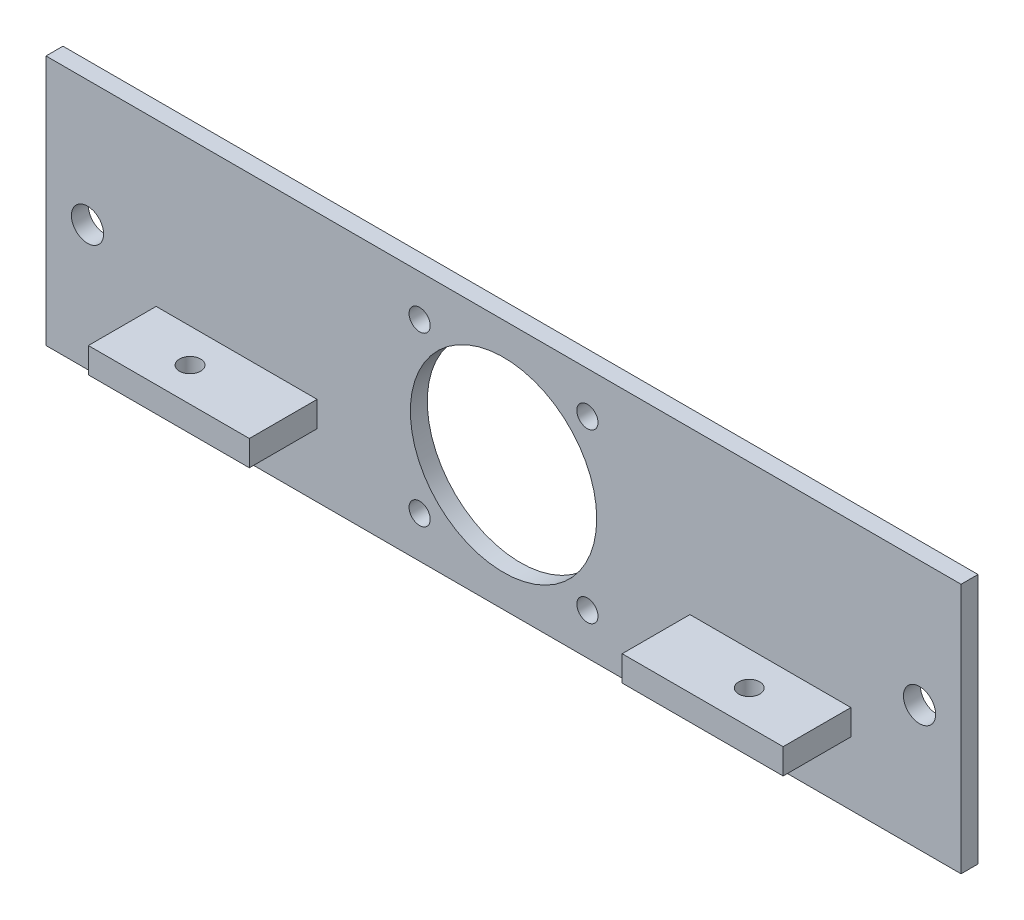
ISO-10303-21;
HEADER;
FILE_DESCRIPTION(('STEP AP214'),'2;1');
FILE_NAME('part.step','',(''),(''),'','','');
FILE_SCHEMA(('AUTOMOTIVE_DESIGN { 1 0 10303 214 1 1 1 1 }'));
ENDSEC;
DATA;
#1=APPLICATION_CONTEXT('core data for automotive mechanical design processes');
#2=APPLICATION_PROTOCOL_DEFINITION('international standard','automotive_design',2000,#1);
#3=PRODUCT_CONTEXT('',#1,'mechanical');
#4=PRODUCT('Part','Part','',(#3));
#5=PRODUCT_RELATED_PRODUCT_CATEGORY('part','',(#4));
#6=PRODUCT_DEFINITION_FORMATION('','',#4);
#7=PRODUCT_DEFINITION_CONTEXT('part definition',#1,'design');
#8=PRODUCT_DEFINITION('design','',#6,#7);
#9=PRODUCT_DEFINITION_SHAPE('','',#8);
#10=(LENGTH_UNIT() NAMED_UNIT(*) SI_UNIT(.MILLI.,.METRE.));
#11=(NAMED_UNIT(*) PLANE_ANGLE_UNIT() SI_UNIT($,.RADIAN.));
#12=(NAMED_UNIT(*) SI_UNIT($,.STERADIAN.) SOLID_ANGLE_UNIT());
#13=UNCERTAINTY_MEASURE_WITH_UNIT(LENGTH_MEASURE(1.E-05),#10,'distance_accuracy_value','');
#14=(GEOMETRIC_REPRESENTATION_CONTEXT(3) GLOBAL_UNCERTAINTY_ASSIGNED_CONTEXT((#13)) GLOBAL_UNIT_ASSIGNED_CONTEXT((#10,
#11,#12)) REPRESENTATION_CONTEXT('',''));
#15=CARTESIAN_POINT('',(0.,0.,0.));
#16=DIRECTION('',(0.,0.,1.));
#17=DIRECTION('',(1.,0.,0.));
#18=AXIS2_PLACEMENT_3D('',#15,#16,#17);
#19=CARTESIAN_POINT('',(54.,-14.8,-10.));
#20=DIRECTION('',(1.,0.,0.));
#21=DIRECTION('',(0.,0.,-1.));
#22=AXIS2_PLACEMENT_3D('',#19,#20,#21);
#23=PLANE('',#22);
#24=DIRECTION('',(0.,0.,1.));
#25=VECTOR('',#24,1.);
#26=CARTESIAN_POINT('',(54.,14.8,-10.));
#27=LINE('',#26,#25);
#28=CARTESIAN_POINT('',(54.,14.8,-10.));
#29=VERTEX_POINT('',#28);
#30=CARTESIAN_POINT('',(54.,14.8,-8.));
#31=VERTEX_POINT('',#30);
#32=EDGE_CURVE('E242',#29,#31,#27,.T.);
#33=ORIENTED_EDGE('',*,*,#32,.T.);
#34=DIRECTION('',(0.,-1.,0.));
#35=VECTOR('',#34,1.);
#36=CARTESIAN_POINT('',(54.,-14.8,-8.));
#37=LINE('',#36,#35);
#38=CARTESIAN_POINT('',(54.,-14.8,-8.));
#39=VERTEX_POINT('',#38);
#40=EDGE_CURVE('E55',#31,#39,#37,.T.);
#41=ORIENTED_EDGE('',*,*,#40,.T.);
#42=DIRECTION('',(0.,0.,1.));
#43=VECTOR('',#42,1.);
#44=CARTESIAN_POINT('',(54.,-14.8,-10.));
#45=LINE('',#44,#43);
#46=CARTESIAN_POINT('',(54.,-14.8,-10.));
#47=VERTEX_POINT('',#46);
#48=EDGE_CURVE('E12',#47,#39,#45,.T.);
#49=ORIENTED_EDGE('',*,*,#48,.F.);
#50=DIRECTION('',(0.,1.,0.));
#51=VECTOR('',#50,1.);
#52=CARTESIAN_POINT('',(54.,-14.8,-10.));
#53=LINE('',#52,#51);
#54=EDGE_CURVE('E231',#47,#29,#53,.T.);
#55=ORIENTED_EDGE('',*,*,#54,.T.);
#56=EDGE_LOOP('',(#33,#41,#49,#55));
#57=FACE_BOUND('',#56,.T.);
#58=ADVANCED_FACE('F39',(#57),#23,.T.);
#59=CARTESIAN_POINT('',(-54.,-14.8,-10.));
#60=DIRECTION('',(0.,-1.,0.));
#61=DIRECTION('',(0.,0.,-1.));
#62=AXIS2_PLACEMENT_3D('',#59,#60,#61);
#63=PLANE('',#62);
#64=ORIENTED_EDGE('',*,*,#48,.T.);
#65=DIRECTION('',(-1.,0.,0.));
#66=VECTOR('',#65,1.);
#67=CARTESIAN_POINT('',(-54.,-14.8,-8.));
#68=LINE('',#67,#66);
#69=CARTESIAN_POINT('',(-54.,-14.8,-8.));
#70=VERTEX_POINT('',#69);
#71=EDGE_CURVE('E218',#39,#70,#68,.T.);
#72=ORIENTED_EDGE('',*,*,#71,.T.);
#73=DIRECTION('',(0.,0.,1.));
#74=VECTOR('',#73,1.);
#75=CARTESIAN_POINT('',(-54.,-14.8,-10.));
#76=LINE('',#75,#74);
#77=CARTESIAN_POINT('',(-54.,-14.8,-10.));
#78=VERTEX_POINT('',#77);
#79=EDGE_CURVE('E47',#78,#70,#76,.T.);
#80=ORIENTED_EDGE('',*,*,#79,.F.);
#81=DIRECTION('',(1.,0.,0.));
#82=VECTOR('',#81,1.);
#83=CARTESIAN_POINT('',(-54.,-14.8,-10.));
#84=LINE('',#83,#82);
#85=EDGE_CURVE('E240',#78,#47,#84,.T.);
#86=ORIENTED_EDGE('',*,*,#85,.T.);
#87=EDGE_LOOP('',(#64,#72,#80,#86));
#88=FACE_BOUND('',#87,.T.);
#89=ADVANCED_FACE('F262',(#88),#63,.T.);
#90=CARTESIAN_POINT('',(-54.,-14.8,-10.));
#91=DIRECTION('',(-1.,0.,0.));
#92=DIRECTION('',(0.,0.,1.));
#93=AXIS2_PLACEMENT_3D('',#90,#91,#92);
#94=PLANE('',#93);
#95=ORIENTED_EDGE('',*,*,#79,.T.);
#96=DIRECTION('',(0.,1.,0.));
#97=VECTOR('',#96,1.);
#98=CARTESIAN_POINT('',(-54.,-14.8,-8.));
#99=LINE('',#98,#97);
#100=CARTESIAN_POINT('',(-54.,14.8,-8.));
#101=VERTEX_POINT('',#100);
#102=EDGE_CURVE('E215',#70,#101,#99,.T.);
#103=ORIENTED_EDGE('',*,*,#102,.T.);
#104=DIRECTION('',(0.,0.,1.));
#105=VECTOR('',#104,1.);
#106=CARTESIAN_POINT('',(-54.,14.8,-10.));
#107=LINE('',#106,#105);
#108=CARTESIAN_POINT('',(-54.,14.8,-10.));
#109=VERTEX_POINT('',#108);
#110=EDGE_CURVE('E246',#109,#101,#107,.T.);
#111=ORIENTED_EDGE('',*,*,#110,.F.);
#112=DIRECTION('',(0.,-1.,0.));
#113=VECTOR('',#112,1.);
#114=CARTESIAN_POINT('',(-54.,-14.8,-10.));
#115=LINE('',#114,#113);
#116=EDGE_CURVE('E237',#109,#78,#115,.T.);
#117=ORIENTED_EDGE('',*,*,#116,.T.);
#118=EDGE_LOOP('',(#95,#103,#111,#117));
#119=FACE_BOUND('',#118,.T.);
#120=ADVANCED_FACE('F259',(#119),#94,.T.);
#121=CARTESIAN_POINT('',(-54.,14.8,-10.));
#122=DIRECTION('',(0.,1.,0.));
#123=DIRECTION('',(0.,0.,1.));
#124=AXIS2_PLACEMENT_3D('',#121,#122,#123);
#125=PLANE('',#124);
#126=ORIENTED_EDGE('',*,*,#110,.T.);
#127=DIRECTION('',(1.,0.,0.));
#128=VECTOR('',#127,1.);
#129=CARTESIAN_POINT('',(-54.,14.8,-8.));
#130=LINE('',#129,#128);
#131=EDGE_CURVE('E213',#101,#31,#130,.T.);
#132=ORIENTED_EDGE('',*,*,#131,.T.);
#133=ORIENTED_EDGE('',*,*,#32,.F.);
#134=DIRECTION('',(-1.,0.,0.));
#135=VECTOR('',#134,1.);
#136=CARTESIAN_POINT('',(-54.,14.8,-10.));
#137=LINE('',#136,#135);
#138=EDGE_CURVE('E234',#29,#109,#137,.T.);
#139=ORIENTED_EDGE('',*,*,#138,.T.);
#140=EDGE_LOOP('',(#126,#132,#133,#139));
#141=FACE_BOUND('',#140,.T.);
#142=ADVANCED_FACE('F253',(#141),#125,.T.);
#143=CARTESIAN_POINT('',(-49.1,0.,-10.));
#144=DIRECTION('',(0.,0.,1.));
#145=DIRECTION('',(1.,0.,0.));
#146=AXIS2_PLACEMENT_3D('',#143,#144,#145);
#147=CYLINDRICAL_SURFACE('',#146,1.9);
#148=CARTESIAN_POINT('',(-49.1,0.,-10.));
#149=DIRECTION('',(0.,0.,1.));
#150=DIRECTION('',(1.,0.,0.));
#151=AXIS2_PLACEMENT_3D('',#148,#149,#150);
#152=CIRCLE('',#151,1.9);
#153=CARTESIAN_POINT('',(-47.2,0.,-10.));
#154=VERTEX_POINT('',#153);
#155=EDGE_CURVE('E228',#154,#154,#152,.T.);
#156=ORIENTED_EDGE('',*,*,#155,.F.);
#157=EDGE_LOOP('',(#156));
#158=FACE_BOUND('',#157,.T.);
#159=CARTESIAN_POINT('',(-49.1,0.,-8.));
#160=DIRECTION('',(0.,0.,1.));
#161=DIRECTION('',(1.,0.,0.));
#162=AXIS2_PLACEMENT_3D('',#159,#160,#161);
#163=CIRCLE('',#162,1.9);
#164=CARTESIAN_POINT('',(-47.2,0.,-8.));
#165=VERTEX_POINT('',#164);
#166=EDGE_CURVE('E210',#165,#165,#163,.F.);
#167=ORIENTED_EDGE('',*,*,#166,.F.);
#168=EDGE_LOOP('',(#167));
#169=FACE_BOUND('',#168,.T.);
#170=ADVANCED_FACE('F274',(#158,#169),#147,.F.);
#171=CARTESIAN_POINT('',(49.1,0.,-10.));
#172=DIRECTION('',(0.,0.,1.));
#173=DIRECTION('',(1.,0.,0.));
#174=AXIS2_PLACEMENT_3D('',#171,#172,#173);
#175=CYLINDRICAL_SURFACE('',#174,1.9);
#176=CARTESIAN_POINT('',(49.1,0.,-10.));
#177=DIRECTION('',(0.,0.,1.));
#178=DIRECTION('',(1.,0.,0.));
#179=AXIS2_PLACEMENT_3D('',#176,#177,#178);
#180=CIRCLE('',#179,1.9);
#181=CARTESIAN_POINT('',(51.,0.,-10.));
#182=VERTEX_POINT('',#181);
#183=EDGE_CURVE('E225',#182,#182,#180,.T.);
#184=ORIENTED_EDGE('',*,*,#183,.F.);
#185=EDGE_LOOP('',(#184));
#186=FACE_BOUND('',#185,.T.);
#187=CARTESIAN_POINT('',(49.1,0.,-8.));
#188=DIRECTION('',(0.,0.,1.));
#189=DIRECTION('',(1.,0.,0.));
#190=AXIS2_PLACEMENT_3D('',#187,#188,#189);
#191=CIRCLE('',#190,1.9);
#192=CARTESIAN_POINT('',(51.,0.,-8.));
#193=VERTEX_POINT('',#192);
#194=EDGE_CURVE('E207',#193,#193,#191,.F.);
#195=ORIENTED_EDGE('',*,*,#194,.F.);
#196=EDGE_LOOP('',(#195));
#197=FACE_BOUND('',#196,.T.);
#198=ADVANCED_FACE('F278',(#186,#197),#175,.F.);
#199=CARTESIAN_POINT('',(0.,0.,-10.));
#200=DIRECTION('',(0.,0.,1.));
#201=DIRECTION('',(1.,0.,0.));
#202=AXIS2_PLACEMENT_3D('',#199,#200,#201);
#203=CYLINDRICAL_SURFACE('',#202,11.);
#204=CARTESIAN_POINT('',(0.,0.,-10.));
#205=DIRECTION('',(0.,0.,1.));
#206=DIRECTION('',(1.,0.,0.));
#207=AXIS2_PLACEMENT_3D('',#204,#205,#206);
#208=CIRCLE('',#207,11.);
#209=CARTESIAN_POINT('',(11.,0.,-10.));
#210=VERTEX_POINT('',#209);
#211=EDGE_CURVE('E222',#210,#210,#208,.T.);
#212=ORIENTED_EDGE('',*,*,#211,.F.);
#213=EDGE_LOOP('',(#212));
#214=FACE_BOUND('',#213,.T.);
#215=CARTESIAN_POINT('',(0.,0.,-8.));
#216=DIRECTION('',(0.,0.,1.));
#217=DIRECTION('',(1.,0.,0.));
#218=AXIS2_PLACEMENT_3D('',#215,#216,#217);
#219=CIRCLE('',#218,11.);
#220=CARTESIAN_POINT('',(11.,0.,-8.));
#221=VERTEX_POINT('',#220);
#222=EDGE_CURVE('E42',#221,#221,#219,.F.);
#223=ORIENTED_EDGE('',*,*,#222,.F.);
#224=EDGE_LOOP('',(#223));
#225=FACE_BOUND('',#224,.T.);
#226=ADVANCED_FACE('F284',(#214,#225),#203,.F.);
#227=CARTESIAN_POINT('',(54.,14.8,-10.));
#228=DIRECTION('',(0.,0.,-1.));
#229=DIRECTION('',(-1.,0.,0.));
#230=AXIS2_PLACEMENT_3D('',#227,#228,#229);
#231=PLANE('',#230);
#232=CARTESIAN_POINT('',(9.9,-9.9,-10.));
#233=DIRECTION('',(0.,0.,1.));
#234=DIRECTION('',(1.,0.,0.));
#235=AXIS2_PLACEMENT_3D('',#232,#233,#234);
#236=CIRCLE('',#235,1.25);
#237=CARTESIAN_POINT('',(11.15,-9.9,-10.));
#238=VERTEX_POINT('',#237);
#239=EDGE_CURVE('E303',#238,#238,#236,.T.);
#240=ORIENTED_EDGE('',*,*,#239,.T.);
#241=EDGE_LOOP('',(#240));
#242=FACE_BOUND('',#241,.T.);
#243=CARTESIAN_POINT('',(-9.9,-9.9,-10.));
#244=DIRECTION('',(0.,0.,1.));
#245=DIRECTION('',(1.,0.,0.));
#246=AXIS2_PLACEMENT_3D('',#243,#244,#245);
#247=CIRCLE('',#246,1.25);
#248=CARTESIAN_POINT('',(-8.65,-9.9,-10.));
#249=VERTEX_POINT('',#248);
#250=EDGE_CURVE('E307',#249,#249,#247,.T.);
#251=ORIENTED_EDGE('',*,*,#250,.T.);
#252=EDGE_LOOP('',(#251));
#253=FACE_BOUND('',#252,.T.);
#254=CARTESIAN_POINT('',(9.9,9.9,-10.));
#255=DIRECTION('',(0.,0.,1.));
#256=DIRECTION('',(1.,0.,0.));
#257=AXIS2_PLACEMENT_3D('',#254,#255,#256);
#258=CIRCLE('',#257,1.25);
#259=CARTESIAN_POINT('',(11.15,9.9,-10.));
#260=VERTEX_POINT('',#259);
#261=EDGE_CURVE('E311',#260,#260,#258,.T.);
#262=ORIENTED_EDGE('',*,*,#261,.T.);
#263=EDGE_LOOP('',(#262));
#264=FACE_BOUND('',#263,.T.);
#265=CARTESIAN_POINT('',(-9.9,9.9,-10.));
#266=DIRECTION('',(0.,0.,1.));
#267=DIRECTION('',(1.,0.,0.));
#268=AXIS2_PLACEMENT_3D('',#265,#266,#267);
#269=CIRCLE('',#268,1.25);
#270=CARTESIAN_POINT('',(-8.65,9.9,-10.));
#271=VERTEX_POINT('',#270);
#272=EDGE_CURVE('E315',#271,#271,#269,.T.);
#273=ORIENTED_EDGE('',*,*,#272,.T.);
#274=EDGE_LOOP('',(#273));
#275=FACE_BOUND('',#274,.T.);
#276=ORIENTED_EDGE('',*,*,#211,.T.);
#277=EDGE_LOOP('',(#276));
#278=FACE_BOUND('',#277,.T.);
#279=ORIENTED_EDGE('',*,*,#183,.T.);
#280=EDGE_LOOP('',(#279));
#281=FACE_BOUND('',#280,.T.);
#282=ORIENTED_EDGE('',*,*,#155,.T.);
#283=EDGE_LOOP('',(#282));
#284=FACE_BOUND('',#283,.T.);
#285=ORIENTED_EDGE('',*,*,#54,.F.);
#286=ORIENTED_EDGE('',*,*,#85,.F.);
#287=ORIENTED_EDGE('',*,*,#116,.F.);
#288=ORIENTED_EDGE('',*,*,#138,.F.);
#289=EDGE_LOOP('',(#285,#286,#287,#288));
#290=FACE_BOUND('',#289,.T.);
#291=ADVANCED_FACE('F256',(#242,#253,#264,#275,#278,#281,#284,#290),#231,.T.);
#292=CARTESIAN_POINT('',(0.,0.,-8.));
#293=DIRECTION('',(0.,0.,1.));
#294=DIRECTION('',(1.,0.,0.));
#295=AXIS2_PLACEMENT_3D('',#292,#293,#294);
#296=PLANE('',#295);
#297=CARTESIAN_POINT('',(9.9,-9.9,-8.));
#298=DIRECTION('',(0.,0.,1.));
#299=DIRECTION('',(1.,0.,0.));
#300=AXIS2_PLACEMENT_3D('',#297,#298,#299);
#301=CIRCLE('',#300,1.24999999999999);
#302=CARTESIAN_POINT('',(11.15,-9.9,-8.));
#303=VERTEX_POINT('',#302);
#304=EDGE_CURVE('E561',#303,#303,#301,.T.);
#305=ORIENTED_EDGE('',*,*,#304,.F.);
#306=EDGE_LOOP('',(#305));
#307=FACE_BOUND('',#306,.T.);
#308=CARTESIAN_POINT('',(-9.9,-9.9,-8.));
#309=DIRECTION('',(0.,0.,1.));
#310=DIRECTION('',(1.,0.,0.));
#311=AXIS2_PLACEMENT_3D('',#308,#309,#310);
#312=CIRCLE('',#311,1.24999999999999);
#313=CARTESIAN_POINT('',(-8.65000000000001,-9.9,-8.));
#314=VERTEX_POINT('',#313);
#315=EDGE_CURVE('E563',#314,#314,#312,.T.);
#316=ORIENTED_EDGE('',*,*,#315,.F.);
#317=EDGE_LOOP('',(#316));
#318=FACE_BOUND('',#317,.T.);
#319=CARTESIAN_POINT('',(9.9,9.9,-8.));
#320=DIRECTION('',(0.,0.,1.));
#321=DIRECTION('',(1.,0.,0.));
#322=AXIS2_PLACEMENT_3D('',#319,#320,#321);
#323=CIRCLE('',#322,1.24999999999999);
#324=CARTESIAN_POINT('',(11.15,9.9,-8.));
#325=VERTEX_POINT('',#324);
#326=EDGE_CURVE('E569',#325,#325,#323,.T.);
#327=ORIENTED_EDGE('',*,*,#326,.F.);
#328=EDGE_LOOP('',(#327));
#329=FACE_BOUND('',#328,.T.);
#330=CARTESIAN_POINT('',(-9.9,9.9,-8.));
#331=DIRECTION('',(0.,0.,1.));
#332=DIRECTION('',(1.,0.,0.));
#333=AXIS2_PLACEMENT_3D('',#330,#331,#332);
#334=CIRCLE('',#333,1.24999999999999);
#335=CARTESIAN_POINT('',(-8.65000000000001,9.9,-8.));
#336=VERTEX_POINT('',#335);
#337=EDGE_CURVE('E573',#336,#336,#334,.T.);
#338=ORIENTED_EDGE('',*,*,#337,.F.);
#339=EDGE_LOOP('',(#338));
#340=FACE_BOUND('',#339,.T.);
#341=ORIENTED_EDGE('',*,*,#131,.F.);
#342=ORIENTED_EDGE('',*,*,#102,.F.);
#343=ORIENTED_EDGE('',*,*,#71,.F.);
#344=ORIENTED_EDGE('',*,*,#40,.F.);
#345=EDGE_LOOP('',(#341,#342,#343,#344));
#346=FACE_BOUND('',#345,.T.);
#347=ORIENTED_EDGE('',*,*,#194,.T.);
#348=EDGE_LOOP('',(#347));
#349=FACE_BOUND('',#348,.T.);
#350=DIRECTION('',(1.,0.,0.));
#351=VECTOR('',#350,1.);
#352=CARTESIAN_POINT('',(41.,-7.3,-8.));
#353=LINE('',#352,#351);
#354=CARTESIAN_POINT('',(22.,-7.3,-8.));
#355=VERTEX_POINT('',#354);
#356=CARTESIAN_POINT('',(41.,-7.3,-8.));
#357=VERTEX_POINT('',#356);
#358=EDGE_CURVE('E188',#355,#357,#353,.T.);
#359=ORIENTED_EDGE('',*,*,#358,.F.);
#360=DIRECTION('',(0.,-1.,0.));
#361=VECTOR('',#360,1.);
#362=CARTESIAN_POINT('',(22.,-7.3,-8.));
#363=LINE('',#362,#361);
#364=CARTESIAN_POINT('',(22.,-4.3,-8.));
#365=VERTEX_POINT('',#364);
#366=EDGE_CURVE('E185',#365,#355,#363,.T.);
#367=ORIENTED_EDGE('',*,*,#366,.F.);
#368=DIRECTION('',(-1.,0.,0.));
#369=VECTOR('',#368,1.);
#370=CARTESIAN_POINT('',(41.,-4.3,-8.));
#371=LINE('',#370,#369);
#372=CARTESIAN_POINT('',(41.,-4.3,-8.));
#373=VERTEX_POINT('',#372);
#374=EDGE_CURVE('E181',#373,#365,#371,.T.);
#375=ORIENTED_EDGE('',*,*,#374,.F.);
#376=DIRECTION('',(0.,1.,0.));
#377=VECTOR('',#376,1.);
#378=CARTESIAN_POINT('',(41.,-7.3,-8.));
#379=LINE('',#378,#377);
#380=EDGE_CURVE('E178',#357,#373,#379,.T.);
#381=ORIENTED_EDGE('',*,*,#380,.F.);
#382=EDGE_LOOP('',(#359,#367,#375,#381));
#383=FACE_BOUND('',#382,.T.);
#384=DIRECTION('',(-1.,0.,0.));
#385=VECTOR('',#384,1.);
#386=CARTESIAN_POINT('',(-41.,-4.3,-8.));
#387=LINE('',#386,#385);
#388=CARTESIAN_POINT('',(-22.,-4.3,-8.));
#389=VERTEX_POINT('',#388);
#390=CARTESIAN_POINT('',(-41.,-4.3,-8.));
#391=VERTEX_POINT('',#390);
#392=EDGE_CURVE('E142',#389,#391,#387,.T.);
#393=ORIENTED_EDGE('',*,*,#392,.F.);
#394=DIRECTION('',(0.,1.,0.));
#395=VECTOR('',#394,1.);
#396=CARTESIAN_POINT('',(-22.,-4.3,-8.));
#397=LINE('',#396,#395);
#398=CARTESIAN_POINT('',(-22.,-7.3,-8.));
#399=VERTEX_POINT('',#398);
#400=EDGE_CURVE('E152',#399,#389,#397,.T.);
#401=ORIENTED_EDGE('',*,*,#400,.F.);
#402=DIRECTION('',(1.,0.,0.));
#403=VECTOR('',#402,1.);
#404=CARTESIAN_POINT('',(-41.,-7.3,-8.));
#405=LINE('',#404,#403);
#406=CARTESIAN_POINT('',(-41.,-7.3,-8.));
#407=VERTEX_POINT('',#406);
#408=EDGE_CURVE('E134',#407,#399,#405,.T.);
#409=ORIENTED_EDGE('',*,*,#408,.F.);
#410=DIRECTION('',(0.,-1.,0.));
#411=VECTOR('',#410,1.);
#412=CARTESIAN_POINT('',(-41.,-4.3,-8.));
#413=LINE('',#412,#411);
#414=EDGE_CURVE('E149',#391,#407,#413,.T.);
#415=ORIENTED_EDGE('',*,*,#414,.F.);
#416=EDGE_LOOP('',(#393,#401,#409,#415));
#417=FACE_BOUND('',#416,.T.);
#418=ORIENTED_EDGE('',*,*,#222,.T.);
#419=EDGE_LOOP('',(#418));
#420=FACE_BOUND('',#419,.T.);
#421=ORIENTED_EDGE('',*,*,#166,.T.);
#422=EDGE_LOOP('',(#421));
#423=FACE_BOUND('',#422,.T.);
#424=ADVANCED_FACE('F147',(#307,#318,#329,#340,#346,#349,#383,#417,#420,#423),#296,.T.);
#425=CARTESIAN_POINT('',(41.,-7.3,-8.));
#426=DIRECTION('',(1.,0.,0.));
#427=DIRECTION('',(0.,0.,-1.));
#428=AXIS2_PLACEMENT_3D('',#425,#426,#427);
#429=PLANE('',#428);
#430=DIRECTION('',(0.,1.,0.));
#431=VECTOR('',#430,1.);
#432=CARTESIAN_POINT('',(41.,-7.3,0.));
#433=LINE('',#432,#431);
#434=CARTESIAN_POINT('',(41.,-7.3,0.));
#435=VERTEX_POINT('',#434);
#436=CARTESIAN_POINT('',(41.,-4.3,0.));
#437=VERTEX_POINT('',#436);
#438=EDGE_CURVE('E174',#435,#437,#433,.T.);
#439=ORIENTED_EDGE('',*,*,#438,.F.);
#440=DIRECTION('',(0.,0.,1.));
#441=VECTOR('',#440,1.);
#442=CARTESIAN_POINT('',(41.,-7.3,-8.));
#443=LINE('',#442,#441);
#444=EDGE_CURVE('E200',#357,#435,#443,.T.);
#445=ORIENTED_EDGE('',*,*,#444,.F.);
#446=ORIENTED_EDGE('',*,*,#380,.T.);
#447=DIRECTION('',(0.,0.,1.));
#448=VECTOR('',#447,1.);
#449=CARTESIAN_POINT('',(41.,-4.3,-8.));
#450=LINE('',#449,#448);
#451=EDGE_CURVE('E191',#373,#437,#450,.T.);
#452=ORIENTED_EDGE('',*,*,#451,.T.);
#453=EDGE_LOOP('',(#439,#445,#446,#452));
#454=FACE_BOUND('',#453,.T.);
#455=ADVANCED_FACE('F296',(#454),#429,.T.);
#456=CARTESIAN_POINT('',(41.,-7.3,-8.));
#457=DIRECTION('',(0.,-1.,0.));
#458=DIRECTION('',(1.,0.,0.));
#459=AXIS2_PLACEMENT_3D('',#456,#457,#458);
#460=PLANE('',#459);
#461=CARTESIAN_POINT('',(33.,-7.3,-4.));
#462=DIRECTION('',(0.,-1.,0.));
#463=DIRECTION('',(1.,0.,0.));
#464=AXIS2_PLACEMENT_3D('',#461,#462,#463);
#465=CIRCLE('',#464,1.24999999999999);
#466=CARTESIAN_POINT('',(34.25,-7.3,-4.));
#467=VERTEX_POINT('',#466);
#468=EDGE_CURVE('E580',#467,#467,#465,.T.);
#469=ORIENTED_EDGE('',*,*,#468,.F.);
#470=EDGE_LOOP('',(#469));
#471=FACE_BOUND('',#470,.T.);
#472=DIRECTION('',(1.,0.,0.));
#473=VECTOR('',#472,1.);
#474=CARTESIAN_POINT('',(41.,-7.3,0.));
#475=LINE('',#474,#473);
#476=CARTESIAN_POINT('',(22.,-7.3,0.));
#477=VERTEX_POINT('',#476);
#478=EDGE_CURVE('E182',#477,#435,#475,.T.);
#479=ORIENTED_EDGE('',*,*,#478,.F.);
#480=DIRECTION('',(0.,0.,1.));
#481=VECTOR('',#480,1.);
#482=CARTESIAN_POINT('',(22.,-7.3,-8.));
#483=LINE('',#482,#481);
#484=EDGE_CURVE('E202',#355,#477,#483,.T.);
#485=ORIENTED_EDGE('',*,*,#484,.F.);
#486=ORIENTED_EDGE('',*,*,#358,.T.);
#487=ORIENTED_EDGE('',*,*,#444,.T.);
#488=EDGE_LOOP('',(#479,#485,#486,#487));
#489=FACE_BOUND('',#488,.T.);
#490=ADVANCED_FACE('F334',(#471,#489),#460,.T.);
#491=CARTESIAN_POINT('',(22.,-7.3,-8.));
#492=DIRECTION('',(-1.,0.,0.));
#493=DIRECTION('',(0.,0.,1.));
#494=AXIS2_PLACEMENT_3D('',#491,#492,#493);
#495=PLANE('',#494);
#496=DIRECTION('',(0.,-1.,0.));
#497=VECTOR('',#496,1.);
#498=CARTESIAN_POINT('',(22.,-7.3,0.));
#499=LINE('',#498,#497);
#500=CARTESIAN_POINT('',(22.,-4.3,0.));
#501=VERTEX_POINT('',#500);
#502=EDGE_CURVE('E63',#501,#477,#499,.T.);
#503=ORIENTED_EDGE('',*,*,#502,.F.);
#504=DIRECTION('',(0.,0.,1.));
#505=VECTOR('',#504,1.);
#506=CARTESIAN_POINT('',(22.,-4.3,-8.));
#507=LINE('',#506,#505);
#508=EDGE_CURVE('E204',#365,#501,#507,.T.);
#509=ORIENTED_EDGE('',*,*,#508,.F.);
#510=ORIENTED_EDGE('',*,*,#366,.T.);
#511=ORIENTED_EDGE('',*,*,#484,.T.);
#512=EDGE_LOOP('',(#503,#509,#510,#511));
#513=FACE_BOUND('',#512,.T.);
#514=ADVANCED_FACE('F327',(#513),#495,.T.);
#515=CARTESIAN_POINT('',(41.,-4.3,-8.));
#516=DIRECTION('',(0.,1.,0.));
#517=DIRECTION('',(-1.,0.,0.));
#518=AXIS2_PLACEMENT_3D('',#515,#516,#517);
#519=PLANE('',#518);
#520=CARTESIAN_POINT('',(33.,-4.3,-4.));
#521=DIRECTION('',(0.,1.,0.));
#522=DIRECTION('',(0.,0.,1.));
#523=AXIS2_PLACEMENT_3D('',#520,#521,#522);
#524=CIRCLE('',#523,1.24999999999999);
#525=CARTESIAN_POINT('',(33.,-4.3,-2.75000000000001));
#526=VERTEX_POINT('',#525);
#527=EDGE_CURVE('E577',#526,#526,#524,.T.);
#528=ORIENTED_EDGE('',*,*,#527,.F.);
#529=EDGE_LOOP('',(#528));
#530=FACE_BOUND('',#529,.T.);
#531=DIRECTION('',(-1.,0.,0.));
#532=VECTOR('',#531,1.);
#533=CARTESIAN_POINT('',(41.,-4.3,0.));
#534=LINE('',#533,#532);
#535=EDGE_CURVE('E194',#437,#501,#534,.T.);
#536=ORIENTED_EDGE('',*,*,#535,.F.);
#537=ORIENTED_EDGE('',*,*,#451,.F.);
#538=ORIENTED_EDGE('',*,*,#374,.T.);
#539=ORIENTED_EDGE('',*,*,#508,.T.);
#540=EDGE_LOOP('',(#536,#537,#538,#539));
#541=FACE_BOUND('',#540,.T.);
#542=ADVANCED_FACE('F331',(#530,#541),#519,.T.);
#543=CARTESIAN_POINT('',(-41.,-4.3,-8.));
#544=DIRECTION('',(-1.,0.,0.));
#545=DIRECTION('',(0.,0.,1.));
#546=AXIS2_PLACEMENT_3D('',#543,#544,#545);
#547=PLANE('',#546);
#548=DIRECTION('',(0.,-1.,0.));
#549=VECTOR('',#548,1.);
#550=CARTESIAN_POINT('',(-41.,-4.3,0.));
#551=LINE('',#550,#549);
#552=CARTESIAN_POINT('',(-41.,-4.3,0.));
#553=VERTEX_POINT('',#552);
#554=CARTESIAN_POINT('',(-41.,-7.3,0.));
#555=VERTEX_POINT('',#554);
#556=EDGE_CURVE('E168',#553,#555,#551,.T.);
#557=ORIENTED_EDGE('',*,*,#556,.F.);
#558=DIRECTION('',(0.,0.,1.));
#559=VECTOR('',#558,1.);
#560=CARTESIAN_POINT('',(-41.,-4.3,-8.));
#561=LINE('',#560,#559);
#562=EDGE_CURVE('E156',#391,#553,#561,.T.);
#563=ORIENTED_EDGE('',*,*,#562,.F.);
#564=ORIENTED_EDGE('',*,*,#414,.T.);
#565=DIRECTION('',(0.,0.,1.));
#566=VECTOR('',#565,1.);
#567=CARTESIAN_POINT('',(-41.,-7.3,-8.));
#568=LINE('',#567,#566);
#569=EDGE_CURVE('E130',#407,#555,#568,.T.);
#570=ORIENTED_EDGE('',*,*,#569,.T.);
#571=EDGE_LOOP('',(#557,#563,#564,#570));
#572=FACE_BOUND('',#571,.T.);
#573=ADVANCED_FACE('F155',(#572),#547,.T.);
#574=CARTESIAN_POINT('',(-41.,-4.3,-8.));
#575=DIRECTION('',(0.,1.,0.));
#576=DIRECTION('',(0.,0.,1.));
#577=AXIS2_PLACEMENT_3D('',#574,#575,#576);
#578=PLANE('',#577);
#579=CARTESIAN_POINT('',(-33.,-4.3,-4.));
#580=DIRECTION('',(0.,1.,0.));
#581=DIRECTION('',(0.,0.,1.));
#582=AXIS2_PLACEMENT_3D('',#579,#580,#581);
#583=CIRCLE('',#582,1.24999999999999);
#584=CARTESIAN_POINT('',(-33.,-4.3,-2.75000000000001));
#585=VERTEX_POINT('',#584);
#586=EDGE_CURVE('E582',#585,#585,#583,.T.);
#587=ORIENTED_EDGE('',*,*,#586,.F.);
#588=EDGE_LOOP('',(#587));
#589=FACE_BOUND('',#588,.T.);
#590=DIRECTION('',(-1.,0.,0.));
#591=VECTOR('',#590,1.);
#592=CARTESIAN_POINT('',(-41.,-4.3,0.));
#593=LINE('',#592,#591);
#594=CARTESIAN_POINT('',(-22.,-4.3,0.));
#595=VERTEX_POINT('',#594);
#596=EDGE_CURVE('E157',#595,#553,#593,.T.);
#597=ORIENTED_EDGE('',*,*,#596,.F.);
#598=DIRECTION('',(0.,0.,1.));
#599=VECTOR('',#598,1.);
#600=CARTESIAN_POINT('',(-22.,-4.3,-8.));
#601=LINE('',#600,#599);
#602=EDGE_CURVE('E175',#389,#595,#601,.T.);
#603=ORIENTED_EDGE('',*,*,#602,.F.);
#604=ORIENTED_EDGE('',*,*,#392,.T.);
#605=ORIENTED_EDGE('',*,*,#562,.T.);
#606=EDGE_LOOP('',(#597,#603,#604,#605));
#607=FACE_BOUND('',#606,.T.);
#608=ADVANCED_FACE('F355',(#589,#607),#578,.T.);
#609=CARTESIAN_POINT('',(-22.,-4.3,-8.));
#610=DIRECTION('',(1.,0.,0.));
#611=DIRECTION('',(0.,0.,-1.));
#612=AXIS2_PLACEMENT_3D('',#609,#610,#611);
#613=PLANE('',#612);
#614=DIRECTION('',(0.,1.,0.));
#615=VECTOR('',#614,1.);
#616=CARTESIAN_POINT('',(-22.,-4.3,0.));
#617=LINE('',#616,#615);
#618=CARTESIAN_POINT('',(-22.,-7.3,0.));
#619=VERTEX_POINT('',#618);
#620=EDGE_CURVE('E160',#619,#595,#617,.T.);
#621=ORIENTED_EDGE('',*,*,#620,.F.);
#622=DIRECTION('',(0.,0.,1.));
#623=VECTOR('',#622,1.);
#624=CARTESIAN_POINT('',(-22.,-7.3,-8.));
#625=LINE('',#624,#623);
#626=EDGE_CURVE('E141',#399,#619,#625,.T.);
#627=ORIENTED_EDGE('',*,*,#626,.F.);
#628=ORIENTED_EDGE('',*,*,#400,.T.);
#629=ORIENTED_EDGE('',*,*,#602,.T.);
#630=EDGE_LOOP('',(#621,#627,#628,#629));
#631=FACE_BOUND('',#630,.T.);
#632=ADVANCED_FACE('F350',(#631),#613,.T.);
#633=CARTESIAN_POINT('',(-41.,-7.3,-8.));
#634=DIRECTION('',(0.,-1.,0.));
#635=DIRECTION('',(0.,0.,-1.));
#636=AXIS2_PLACEMENT_3D('',#633,#634,#635);
#637=PLANE('',#636);
#638=CARTESIAN_POINT('',(-33.,-7.3,-4.));
#639=DIRECTION('',(0.,-1.,0.));
#640=DIRECTION('',(0.,0.,-1.));
#641=AXIS2_PLACEMENT_3D('',#638,#639,#640);
#642=CIRCLE('',#641,1.24999999999999);
#643=CARTESIAN_POINT('',(-33.,-7.3,-5.24999999999999));
#644=VERTEX_POINT('',#643);
#645=EDGE_CURVE('E163',#644,#644,#642,.T.);
#646=ORIENTED_EDGE('',*,*,#645,.F.);
#647=EDGE_LOOP('',(#646));
#648=FACE_BOUND('',#647,.T.);
#649=DIRECTION('',(1.,0.,0.));
#650=VECTOR('',#649,1.);
#651=CARTESIAN_POINT('',(-41.,-7.3,0.));
#652=LINE('',#651,#650);
#653=EDGE_CURVE('E136',#555,#619,#652,.T.);
#654=ORIENTED_EDGE('',*,*,#653,.F.);
#655=ORIENTED_EDGE('',*,*,#569,.F.);
#656=ORIENTED_EDGE('',*,*,#408,.T.);
#657=ORIENTED_EDGE('',*,*,#626,.T.);
#658=EDGE_LOOP('',(#654,#655,#656,#657));
#659=FACE_BOUND('',#658,.T.);
#660=ADVANCED_FACE('F132',(#648,#659),#637,.T.);
#661=CARTESIAN_POINT('',(54.,14.8,0.));
#662=DIRECTION('',(0.,0.,-1.));
#663=DIRECTION('',(-1.,0.,0.));
#664=AXIS2_PLACEMENT_3D('',#661,#662,#663);
#665=PLANE('',#664);
#666=ORIENTED_EDGE('',*,*,#556,.T.);
#667=ORIENTED_EDGE('',*,*,#653,.T.);
#668=ORIENTED_EDGE('',*,*,#620,.T.);
#669=ORIENTED_EDGE('',*,*,#596,.T.);
#670=EDGE_LOOP('',(#666,#667,#668,#669));
#671=FACE_BOUND('',#670,.T.);
#672=ADVANCED_FACE('F338',(#671),#665,.F.);
#673=ORIENTED_EDGE('',*,*,#438,.T.);
#674=ORIENTED_EDGE('',*,*,#535,.T.);
#675=ORIENTED_EDGE('',*,*,#502,.T.);
#676=ORIENTED_EDGE('',*,*,#478,.T.);
#677=EDGE_LOOP('',(#673,#674,#675,#676));
#678=FACE_BOUND('',#677,.T.);
#679=ADVANCED_FACE('F271',(#678),#665,.F.);
#680=CARTESIAN_POINT('',(-33.,-4.3,-4.));
#681=DIRECTION('',(0.,1.,0.));
#682=DIRECTION('',(0.,0.,1.));
#683=AXIS2_PLACEMENT_3D('',#680,#681,#682);
#684=CYLINDRICAL_SURFACE('',#683,1.24999999999999);
#685=ORIENTED_EDGE('',*,*,#645,.T.);
#686=EDGE_LOOP('',(#685));
#687=FACE_BOUND('',#686,.T.);
#688=ORIENTED_EDGE('',*,*,#586,.T.);
#689=EDGE_LOOP('',(#688));
#690=FACE_BOUND('',#689,.T.);
#691=ADVANCED_FACE('F337',(#687,#690),#684,.F.);
#692=CARTESIAN_POINT('',(33.,-4.3,-4.));
#693=DIRECTION('',(0.,1.,0.));
#694=DIRECTION('',(0.,0.,1.));
#695=AXIS2_PLACEMENT_3D('',#692,#693,#694);
#696=CYLINDRICAL_SURFACE('',#695,1.24999999999999);
#697=ORIENTED_EDGE('',*,*,#468,.T.);
#698=EDGE_LOOP('',(#697));
#699=FACE_BOUND('',#698,.T.);
#700=ORIENTED_EDGE('',*,*,#527,.T.);
#701=EDGE_LOOP('',(#700));
#702=FACE_BOUND('',#701,.T.);
#703=ADVANCED_FACE('F343',(#699,#702),#696,.F.);
#704=CARTESIAN_POINT('',(-9.9,9.9,-8.));
#705=DIRECTION('',(0.,0.,1.));
#706=DIRECTION('',(1.,0.,0.));
#707=AXIS2_PLACEMENT_3D('',#704,#705,#706);
#708=CYLINDRICAL_SURFACE('',#707,1.24999999999999);
#709=ORIENTED_EDGE('',*,*,#272,.F.);
#710=EDGE_LOOP('',(#709));
#711=FACE_BOUND('',#710,.T.);
#712=ORIENTED_EDGE('',*,*,#337,.T.);
#713=EDGE_LOOP('',(#712));
#714=FACE_BOUND('',#713,.T.);
#715=ADVANCED_FACE('F425',(#711,#714),#708,.F.);
#716=CARTESIAN_POINT('',(9.9,9.9,-8.));
#717=DIRECTION('',(0.,0.,1.));
#718=DIRECTION('',(1.,0.,0.));
#719=AXIS2_PLACEMENT_3D('',#716,#717,#718);
#720=CYLINDRICAL_SURFACE('',#719,1.24999999999999);
#721=ORIENTED_EDGE('',*,*,#261,.F.);
#722=EDGE_LOOP('',(#721));
#723=FACE_BOUND('',#722,.T.);
#724=ORIENTED_EDGE('',*,*,#326,.T.);
#725=EDGE_LOOP('',(#724));
#726=FACE_BOUND('',#725,.T.);
#727=ADVANCED_FACE('F432',(#723,#726),#720,.F.);
#728=CARTESIAN_POINT('',(-9.9,-9.9,-8.));
#729=DIRECTION('',(0.,0.,1.));
#730=DIRECTION('',(1.,0.,0.));
#731=AXIS2_PLACEMENT_3D('',#728,#729,#730);
#732=CYLINDRICAL_SURFACE('',#731,1.24999999999999);
#733=ORIENTED_EDGE('',*,*,#250,.F.);
#734=EDGE_LOOP('',(#733));
#735=FACE_BOUND('',#734,.T.);
#736=ORIENTED_EDGE('',*,*,#315,.T.);
#737=EDGE_LOOP('',(#736));
#738=FACE_BOUND('',#737,.T.);
#739=ADVANCED_FACE('F440',(#735,#738),#732,.F.);
#740=CARTESIAN_POINT('',(9.9,-9.9,-8.));
#741=DIRECTION('',(0.,0.,1.));
#742=DIRECTION('',(1.,0.,0.));
#743=AXIS2_PLACEMENT_3D('',#740,#741,#742);
#744=CYLINDRICAL_SURFACE('',#743,1.24999999999999);
#745=ORIENTED_EDGE('',*,*,#239,.F.);
#746=EDGE_LOOP('',(#745));
#747=FACE_BOUND('',#746,.T.);
#748=ORIENTED_EDGE('',*,*,#304,.T.);
#749=EDGE_LOOP('',(#748));
#750=FACE_BOUND('',#749,.T.);
#751=ADVANCED_FACE('F448',(#747,#750),#744,.F.);
#752=CLOSED_SHELL('',(#58,#89,#120,#142,#170,#198,#226,#291,#424,#455,#490,#514,#542,#573,#608,
#632,#660,#672,#679,#691,#703,#715,#727,#739,#751));
#753=MANIFOLD_SOLID_BREP('B2',#752);
#754=ADVANCED_BREP_SHAPE_REPRESENTATION('',(#18,#753),#14);
#755=SHAPE_DEFINITION_REPRESENTATION(#9,#754);
ENDSEC;
END-ISO-10303-21;
